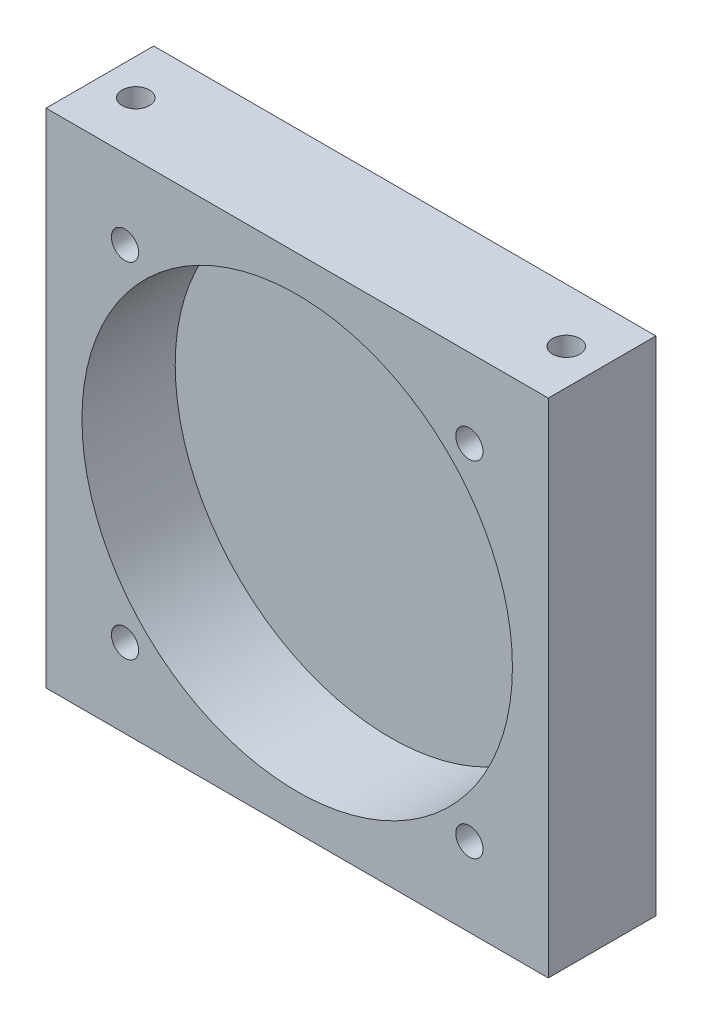
ISO-10303-21;
HEADER;
FILE_DESCRIPTION(('STEP AP214'),'2;1');
FILE_NAME('part.step','',(''),(''),'','','');
FILE_SCHEMA(('AUTOMOTIVE_DESIGN { 1 0 10303 214 1 1 1 1 }'));
ENDSEC;
DATA;
#1=APPLICATION_CONTEXT('core data for automotive mechanical design processes');
#2=APPLICATION_PROTOCOL_DEFINITION('international standard','automotive_design',2000,#1);
#3=PRODUCT_CONTEXT('',#1,'mechanical');
#4=PRODUCT('Part','Part','',(#3));
#5=PRODUCT_RELATED_PRODUCT_CATEGORY('part','',(#4));
#6=PRODUCT_DEFINITION_FORMATION('','',#4);
#7=PRODUCT_DEFINITION_CONTEXT('part definition',#1,'design');
#8=PRODUCT_DEFINITION('design','',#6,#7);
#9=PRODUCT_DEFINITION_SHAPE('','',#8);
#10=(LENGTH_UNIT() NAMED_UNIT(*) SI_UNIT(.MILLI.,.METRE.));
#11=(NAMED_UNIT(*) PLANE_ANGLE_UNIT() SI_UNIT($,.RADIAN.));
#12=(NAMED_UNIT(*) SI_UNIT($,.STERADIAN.) SOLID_ANGLE_UNIT());
#13=UNCERTAINTY_MEASURE_WITH_UNIT(LENGTH_MEASURE(1.E-05),#10,'distance_accuracy_value','');
#14=(GEOMETRIC_REPRESENTATION_CONTEXT(3) GLOBAL_UNCERTAINTY_ASSIGNED_CONTEXT((#13)) GLOBAL_UNIT_ASSIGNED_CONTEXT((#10,
#11,#12)) REPRESENTATION_CONTEXT('',''));
#15=CARTESIAN_POINT('',(0.,0.,0.));
#16=DIRECTION('',(0.,0.,1.));
#17=DIRECTION('',(1.,0.,0.));
#18=AXIS2_PLACEMENT_3D('',#15,#16,#17);
#19=CARTESIAN_POINT('',(-44.45,-44.45,19.05));
#20=DIRECTION('',(1.,0.,0.));
#21=DIRECTION('',(0.,0.,-1.));
#22=AXIS2_PLACEMENT_3D('',#19,#20,#21);
#23=PLANE('',#22);
#24=DIRECTION('',(0.,-1.,0.));
#25=VECTOR('',#24,1.);
#26=CARTESIAN_POINT('',(-44.45,-44.45,0.));
#27=LINE('',#26,#25);
#28=CARTESIAN_POINT('',(-44.45,44.45,0.));
#29=VERTEX_POINT('',#28);
#30=CARTESIAN_POINT('',(-44.45,-44.45,0.));
#31=VERTEX_POINT('',#30);
#32=EDGE_CURVE('E209',#29,#31,#27,.T.);
#33=ORIENTED_EDGE('',*,*,#32,.T.);
#34=DIRECTION('',(0.,0.,-1.));
#35=VECTOR('',#34,1.);
#36=CARTESIAN_POINT('',(-44.45,-44.45,19.05));
#37=LINE('',#36,#35);
#38=CARTESIAN_POINT('',(-44.45,-44.45,19.05));
#39=VERTEX_POINT('',#38);
#40=EDGE_CURVE('E11',#39,#31,#37,.T.);
#41=ORIENTED_EDGE('',*,*,#40,.F.);
#42=DIRECTION('',(0.,-1.,0.));
#43=VECTOR('',#42,1.);
#44=CARTESIAN_POINT('',(-44.45,-44.45,19.05));
#45=LINE('',#44,#43);
#46=CARTESIAN_POINT('',(-44.45,44.45,19.05));
#47=VERTEX_POINT('',#46);
#48=EDGE_CURVE('E212',#47,#39,#45,.T.);
#49=ORIENTED_EDGE('',*,*,#48,.F.);
#50=DIRECTION('',(0.,0.,-1.));
#51=VECTOR('',#50,1.);
#52=CARTESIAN_POINT('',(-44.45,44.45,19.05));
#53=LINE('',#52,#51);
#54=EDGE_CURVE('E218',#47,#29,#53,.T.);
#55=ORIENTED_EDGE('',*,*,#54,.T.);
#56=EDGE_LOOP('',(#33,#41,#49,#55));
#57=FACE_BOUND('',#56,.T.);
#58=ADVANCED_FACE('F32',(#57),#23,.F.);
#59=CARTESIAN_POINT('',(44.45,-44.45,19.05));
#60=DIRECTION('',(0.,1.,0.));
#61=DIRECTION('',(-1.,0.,0.));
#62=AXIS2_PLACEMENT_3D('',#59,#60,#61);
#63=PLANE('',#62);
#64=CARTESIAN_POINT('',(-38.1,-44.45,9.525));
#65=DIRECTION('',(0.,-1.,0.));
#66=DIRECTION('',(0.,0.,-1.));
#67=AXIS2_PLACEMENT_3D('',#64,#65,#66);
#68=CIRCLE('',#67,2.413);
#69=CARTESIAN_POINT('',(-38.1,-44.45,7.112));
#70=VERTEX_POINT('',#69);
#71=EDGE_CURVE('E157',#70,#70,#68,.T.);
#72=ORIENTED_EDGE('',*,*,#71,.F.);
#73=EDGE_LOOP('',(#72));
#74=FACE_BOUND('',#73,.T.);
#75=CARTESIAN_POINT('',(38.1,-44.45,9.525));
#76=DIRECTION('',(0.,-1.,0.));
#77=DIRECTION('',(0.,0.,-1.));
#78=AXIS2_PLACEMENT_3D('',#75,#76,#77);
#79=CIRCLE('',#78,2.413);
#80=CARTESIAN_POINT('',(38.1,-44.45,7.112));
#81=VERTEX_POINT('',#80);
#82=EDGE_CURVE('E169',#81,#81,#79,.T.);
#83=ORIENTED_EDGE('',*,*,#82,.F.);
#84=EDGE_LOOP('',(#83));
#85=FACE_BOUND('',#84,.T.);
#86=DIRECTION('',(1.,0.,0.));
#87=VECTOR('',#86,1.);
#88=CARTESIAN_POINT('',(44.45,-44.45,0.));
#89=LINE('',#88,#87);
#90=CARTESIAN_POINT('',(44.45,-44.45,0.));
#91=VERTEX_POINT('',#90);
#92=EDGE_CURVE('E221',#31,#91,#89,.T.);
#93=ORIENTED_EDGE('',*,*,#92,.T.);
#94=DIRECTION('',(0.,0.,-1.));
#95=VECTOR('',#94,1.);
#96=CARTESIAN_POINT('',(44.45,-44.45,19.05));
#97=LINE('',#96,#95);
#98=CARTESIAN_POINT('',(44.45,-44.45,19.05));
#99=VERTEX_POINT('',#98);
#100=EDGE_CURVE('E40',#99,#91,#97,.T.);
#101=ORIENTED_EDGE('',*,*,#100,.F.);
#102=DIRECTION('',(1.,0.,0.));
#103=VECTOR('',#102,1.);
#104=CARTESIAN_POINT('',(44.45,-44.45,19.05));
#105=LINE('',#104,#103);
#106=EDGE_CURVE('E79',#39,#99,#105,.T.);
#107=ORIENTED_EDGE('',*,*,#106,.F.);
#108=ORIENTED_EDGE('',*,*,#40,.T.);
#109=EDGE_LOOP('',(#93,#101,#107,#108));
#110=FACE_BOUND('',#109,.T.);
#111=ADVANCED_FACE('F246',(#74,#85,#110),#63,.F.);
#112=CARTESIAN_POINT('',(44.45,-44.45,19.05));
#113=DIRECTION('',(-1.,0.,0.));
#114=DIRECTION('',(0.,0.,1.));
#115=AXIS2_PLACEMENT_3D('',#112,#113,#114);
#116=PLANE('',#115);
#117=DIRECTION('',(0.,1.,0.));
#118=VECTOR('',#117,1.);
#119=CARTESIAN_POINT('',(44.45,-44.45,0.));
#120=LINE('',#119,#118);
#121=CARTESIAN_POINT('',(44.45,44.45,0.));
#122=VERTEX_POINT('',#121);
#123=EDGE_CURVE('E66',#91,#122,#120,.T.);
#124=ORIENTED_EDGE('',*,*,#123,.T.);
#125=DIRECTION('',(0.,0.,-1.));
#126=VECTOR('',#125,1.);
#127=CARTESIAN_POINT('',(44.45,44.45,19.05));
#128=LINE('',#127,#126);
#129=CARTESIAN_POINT('',(44.45,44.45,19.05));
#130=VERTEX_POINT('',#129);
#131=EDGE_CURVE('E226',#130,#122,#128,.T.);
#132=ORIENTED_EDGE('',*,*,#131,.F.);
#133=DIRECTION('',(0.,1.,0.));
#134=VECTOR('',#133,1.);
#135=CARTESIAN_POINT('',(44.45,-44.45,19.05));
#136=LINE('',#135,#134);
#137=EDGE_CURVE('E215',#99,#130,#136,.T.);
#138=ORIENTED_EDGE('',*,*,#137,.F.);
#139=ORIENTED_EDGE('',*,*,#100,.T.);
#140=EDGE_LOOP('',(#124,#132,#138,#139));
#141=FACE_BOUND('',#140,.T.);
#142=ADVANCED_FACE('F228',(#141),#116,.F.);
#143=CARTESIAN_POINT('',(44.45,44.45,19.05));
#144=DIRECTION('',(0.,-1.,0.));
#145=DIRECTION('',(1.,0.,0.));
#146=AXIS2_PLACEMENT_3D('',#143,#144,#145);
#147=PLANE('',#146);
#148=CARTESIAN_POINT('',(-38.1,44.45,9.525));
#149=DIRECTION('',(0.,1.,0.));
#150=DIRECTION('',(0.,0.,1.));
#151=AXIS2_PLACEMENT_3D('',#148,#149,#150);
#152=CIRCLE('',#151,2.413);
#153=CARTESIAN_POINT('',(-38.1,44.45,11.938));
#154=VERTEX_POINT('',#153);
#155=EDGE_CURVE('E181',#154,#154,#152,.T.);
#156=ORIENTED_EDGE('',*,*,#155,.F.);
#157=EDGE_LOOP('',(#156));
#158=FACE_BOUND('',#157,.T.);
#159=CARTESIAN_POINT('',(38.1,44.45,9.525));
#160=DIRECTION('',(0.,1.,0.));
#161=DIRECTION('',(0.,0.,1.));
#162=AXIS2_PLACEMENT_3D('',#159,#160,#161);
#163=CIRCLE('',#162,2.413);
#164=CARTESIAN_POINT('',(38.1,44.45,11.938));
#165=VERTEX_POINT('',#164);
#166=EDGE_CURVE('E193',#165,#165,#163,.T.);
#167=ORIENTED_EDGE('',*,*,#166,.F.);
#168=EDGE_LOOP('',(#167));
#169=FACE_BOUND('',#168,.T.);
#170=DIRECTION('',(-1.,0.,0.));
#171=VECTOR('',#170,1.);
#172=CARTESIAN_POINT('',(44.45,44.45,0.));
#173=LINE('',#172,#171);
#174=EDGE_CURVE('E72',#122,#29,#173,.T.);
#175=ORIENTED_EDGE('',*,*,#174,.T.);
#176=ORIENTED_EDGE('',*,*,#54,.F.);
#177=DIRECTION('',(-1.,0.,0.));
#178=VECTOR('',#177,1.);
#179=CARTESIAN_POINT('',(44.45,44.45,19.05));
#180=LINE('',#179,#178);
#181=EDGE_CURVE('E48',#130,#47,#180,.T.);
#182=ORIENTED_EDGE('',*,*,#181,.F.);
#183=ORIENTED_EDGE('',*,*,#131,.T.);
#184=EDGE_LOOP('',(#175,#176,#182,#183));
#185=FACE_BOUND('',#184,.T.);
#186=ADVANCED_FACE('F235',(#158,#169,#185),#147,.F.);
#187=CARTESIAN_POINT('',(-44.45,44.45,19.05));
#188=DIRECTION('',(0.,0.,1.));
#189=DIRECTION('',(1.,0.,0.));
#190=AXIS2_PLACEMENT_3D('',#187,#188,#189);
#191=PLANE('',#190);
#192=CARTESIAN_POINT('',(30.48,-30.48,19.0500000000001));
#193=DIRECTION('',(0.,0.,1.));
#194=DIRECTION('',(1.,0.,0.));
#195=AXIS2_PLACEMENT_3D('',#192,#193,#194);
#196=CIRCLE('',#195,2.413);
#197=CARTESIAN_POINT('',(32.893,-30.48,19.0500000000001));
#198=VERTEX_POINT('',#197);
#199=EDGE_CURVE('E590',#198,#198,#196,.T.);
#200=ORIENTED_EDGE('',*,*,#199,.F.);
#201=EDGE_LOOP('',(#200));
#202=FACE_BOUND('',#201,.T.);
#203=CARTESIAN_POINT('',(-30.48,-30.48,19.0500000000001));
#204=DIRECTION('',(0.,0.,1.));
#205=DIRECTION('',(1.,0.,0.));
#206=AXIS2_PLACEMENT_3D('',#203,#204,#205);
#207=CIRCLE('',#206,2.413);
#208=CARTESIAN_POINT('',(-28.067,-30.48,19.0500000000001));
#209=VERTEX_POINT('',#208);
#210=EDGE_CURVE('E114',#209,#209,#207,.T.);
#211=ORIENTED_EDGE('',*,*,#210,.F.);
#212=EDGE_LOOP('',(#211));
#213=FACE_BOUND('',#212,.T.);
#214=CARTESIAN_POINT('',(-30.48,30.48,19.0500000000001));
#215=DIRECTION('',(0.,0.,1.));
#216=DIRECTION('',(1.,0.,0.));
#217=AXIS2_PLACEMENT_3D('',#214,#215,#216);
#218=CIRCLE('',#217,2.413);
#219=CARTESIAN_POINT('',(-28.067,30.48,19.0500000000001));
#220=VERTEX_POINT('',#219);
#221=EDGE_CURVE('E133',#220,#220,#218,.T.);
#222=ORIENTED_EDGE('',*,*,#221,.F.);
#223=EDGE_LOOP('',(#222));
#224=FACE_BOUND('',#223,.T.);
#225=CARTESIAN_POINT('',(30.48,30.48,19.0500000000001));
#226=DIRECTION('',(0.,0.,1.));
#227=DIRECTION('',(1.,0.,0.));
#228=AXIS2_PLACEMENT_3D('',#225,#226,#227);
#229=CIRCLE('',#228,2.413);
#230=CARTESIAN_POINT('',(32.893,30.48,19.0500000000001));
#231=VERTEX_POINT('',#230);
#232=EDGE_CURVE('E145',#231,#231,#229,.T.);
#233=ORIENTED_EDGE('',*,*,#232,.F.);
#234=EDGE_LOOP('',(#233));
#235=FACE_BOUND('',#234,.T.);
#236=CARTESIAN_POINT('',(0.,0.,19.05));
#237=DIRECTION('',(0.,0.,1.));
#238=DIRECTION('',(1.,0.,0.));
#239=AXIS2_PLACEMENT_3D('',#236,#237,#238);
#240=CIRCLE('',#239,38.1);
#241=CARTESIAN_POINT('',(38.1,0.,19.05));
#242=VERTEX_POINT('',#241);
#243=EDGE_CURVE('E205',#242,#242,#240,.T.);
#244=ORIENTED_EDGE('',*,*,#243,.F.);
#245=EDGE_LOOP('',(#244));
#246=FACE_BOUND('',#245,.T.);
#247=ORIENTED_EDGE('',*,*,#48,.T.);
#248=ORIENTED_EDGE('',*,*,#106,.T.);
#249=ORIENTED_EDGE('',*,*,#137,.T.);
#250=ORIENTED_EDGE('',*,*,#181,.T.);
#251=EDGE_LOOP('',(#247,#248,#249,#250));
#252=FACE_BOUND('',#251,.T.);
#253=ADVANCED_FACE('F237',(#202,#213,#224,#235,#246,#252),#191,.T.);
#254=CARTESIAN_POINT('',(-44.45,44.45,0.));
#255=DIRECTION('',(0.,0.,1.));
#256=DIRECTION('',(1.,0.,0.));
#257=AXIS2_PLACEMENT_3D('',#254,#255,#256);
#258=PLANE('',#257);
#259=ORIENTED_EDGE('',*,*,#32,.F.);
#260=ORIENTED_EDGE('',*,*,#174,.F.);
#261=ORIENTED_EDGE('',*,*,#123,.F.);
#262=ORIENTED_EDGE('',*,*,#92,.F.);
#263=EDGE_LOOP('',(#259,#260,#261,#262));
#264=FACE_BOUND('',#263,.T.);
#265=ADVANCED_FACE('F231',(#264),#258,.F.);
#266=CARTESIAN_POINT('',(0.,0.,2.54));
#267=DIRECTION('',(0.,0.,1.));
#268=DIRECTION('',(1.,0.,0.));
#269=AXIS2_PLACEMENT_3D('',#266,#267,#268);
#270=CYLINDRICAL_SURFACE('',#269,38.1);
#271=CARTESIAN_POINT('',(0.,0.,2.54));
#272=DIRECTION('',(0.,0.,1.));
#273=DIRECTION('',(1.,0.,0.));
#274=AXIS2_PLACEMENT_3D('',#271,#272,#273);
#275=CIRCLE('',#274,38.1);
#276=CARTESIAN_POINT('',(38.1,0.,2.54));
#277=VERTEX_POINT('',#276);
#278=EDGE_CURVE('E206',#277,#277,#275,.T.);
#279=ORIENTED_EDGE('',*,*,#278,.F.);
#280=EDGE_LOOP('',(#279));
#281=FACE_BOUND('',#280,.T.);
#282=ORIENTED_EDGE('',*,*,#243,.T.);
#283=EDGE_LOOP('',(#282));
#284=FACE_BOUND('',#283,.T.);
#285=ADVANCED_FACE('F323',(#281,#284),#270,.F.);
#286=CARTESIAN_POINT('',(0.,0.,2.54));
#287=DIRECTION('',(0.,0.,1.));
#288=DIRECTION('',(1.,0.,0.));
#289=AXIS2_PLACEMENT_3D('',#286,#287,#288);
#290=PLANE('',#289);
#291=ORIENTED_EDGE('',*,*,#278,.T.);
#292=EDGE_LOOP('',(#291));
#293=FACE_BOUND('',#292,.T.);
#294=ADVANCED_FACE('F319',(#293),#290,.T.);
#295=CARTESIAN_POINT('',(38.1,23.02256,9.525));
#296=DIRECTION('',(0.,1.,0.));
#297=DIRECTION('',(0.,0.,1.));
#298=AXIS2_PLACEMENT_3D('',#295,#296,#297);
#299=CONICAL_SURFACE('',#298,2.01929999999999,1.02974425867665);
#300=CARTESIAN_POINT('',(38.1,21.8092421519977,9.525));
#301=VERTEX_POINT('',#300);
#302=VERTEX_LOOP('',#301);
#303=FACE_BOUND('',#302,.T.);
#304=CARTESIAN_POINT('',(38.1,23.02256,9.525));
#305=DIRECTION('',(0.,1.,0.));
#306=DIRECTION('',(0.,0.,1.));
#307=AXIS2_PLACEMENT_3D('',#304,#305,#306);
#308=CIRCLE('',#307,2.01929999999999);
#309=CARTESIAN_POINT('',(38.1,23.02256,11.5443));
#310=VERTEX_POINT('',#309);
#311=EDGE_CURVE('E202',#310,#310,#308,.T.);
#312=ORIENTED_EDGE('',*,*,#311,.T.);
#313=EDGE_LOOP('',(#312));
#314=FACE_BOUND('',#313,.T.);
#315=ADVANCED_FACE('F315',(#303,#314),#299,.F.);
#316=CARTESIAN_POINT('',(38.1,44.45,9.525));
#317=DIRECTION('',(0.,1.,0.));
#318=DIRECTION('',(0.,0.,1.));
#319=AXIS2_PLACEMENT_3D('',#316,#317,#318);
#320=CYLINDRICAL_SURFACE('',#319,2.01929999999999);
#321=ORIENTED_EDGE('',*,*,#311,.F.);
#322=EDGE_LOOP('',(#321));
#323=FACE_BOUND('',#322,.T.);
#324=CARTESIAN_POINT('',(38.1,25.4,9.525));
#325=DIRECTION('',(0.,1.,0.));
#326=DIRECTION('',(0.,0.,1.));
#327=AXIS2_PLACEMENT_3D('',#324,#325,#326);
#328=CIRCLE('',#327,2.01929999999999);
#329=CARTESIAN_POINT('',(38.1,25.4,11.5443));
#330=VERTEX_POINT('',#329);
#331=EDGE_CURVE('E199',#330,#330,#328,.T.);
#332=ORIENTED_EDGE('',*,*,#331,.T.);
#333=EDGE_LOOP('',(#332));
#334=FACE_BOUND('',#333,.T.);
#335=ADVANCED_FACE('F311',(#323,#334),#320,.F.);
#336=CARTESIAN_POINT('',(40.1193,25.4,9.525));
#337=DIRECTION('',(0.,-1.,0.));
#338=DIRECTION('',(0.,0.,-1.));
#339=AXIS2_PLACEMENT_3D('',#336,#337,#338);
#340=PLANE('',#339);
#341=ORIENTED_EDGE('',*,*,#331,.F.);
#342=EDGE_LOOP('',(#341));
#343=FACE_BOUND('',#342,.T.);
#344=CARTESIAN_POINT('',(38.1,25.4,9.525));
#345=DIRECTION('',(0.,1.,0.));
#346=DIRECTION('',(0.,0.,1.));
#347=AXIS2_PLACEMENT_3D('',#344,#345,#346);
#348=CIRCLE('',#347,2.413);
#349=CARTESIAN_POINT('',(38.1,25.4,11.938));
#350=VERTEX_POINT('',#349);
#351=EDGE_CURVE('E196',#350,#350,#348,.T.);
#352=ORIENTED_EDGE('',*,*,#351,.T.);
#353=EDGE_LOOP('',(#352));
#354=FACE_BOUND('',#353,.T.);
#355=ADVANCED_FACE('F307',(#343,#354),#340,.F.);
#356=CARTESIAN_POINT('',(38.1,44.45,9.525));
#357=DIRECTION('',(0.,1.,0.));
#358=DIRECTION('',(0.,0.,1.));
#359=AXIS2_PLACEMENT_3D('',#356,#357,#358);
#360=CYLINDRICAL_SURFACE('',#359,2.413);
#361=ORIENTED_EDGE('',*,*,#351,.F.);
#362=EDGE_LOOP('',(#361));
#363=FACE_BOUND('',#362,.T.);
#364=ORIENTED_EDGE('',*,*,#166,.T.);
#365=EDGE_LOOP('',(#364));
#366=FACE_BOUND('',#365,.T.);
#367=ADVANCED_FACE('F303',(#363,#366),#360,.F.);
#368=CARTESIAN_POINT('',(-38.1,23.02256,9.525));
#369=DIRECTION('',(0.,1.,0.));
#370=DIRECTION('',(0.,0.,1.));
#371=AXIS2_PLACEMENT_3D('',#368,#369,#370);
#372=CONICAL_SURFACE('',#371,2.01929999999999,1.02974425867665);
#373=CARTESIAN_POINT('',(-38.1,21.8092421519977,9.525));
#374=VERTEX_POINT('',#373);
#375=VERTEX_LOOP('',#374);
#376=FACE_BOUND('',#375,.T.);
#377=CARTESIAN_POINT('',(-38.1,23.02256,9.525));
#378=DIRECTION('',(0.,1.,0.));
#379=DIRECTION('',(0.,0.,1.));
#380=AXIS2_PLACEMENT_3D('',#377,#378,#379);
#381=CIRCLE('',#380,2.01929999999999);
#382=CARTESIAN_POINT('',(-38.1,23.02256,11.5443));
#383=VERTEX_POINT('',#382);
#384=EDGE_CURVE('E190',#383,#383,#381,.T.);
#385=ORIENTED_EDGE('',*,*,#384,.T.);
#386=EDGE_LOOP('',(#385));
#387=FACE_BOUND('',#386,.T.);
#388=ADVANCED_FACE('F299',(#376,#387),#372,.F.);
#389=CARTESIAN_POINT('',(-38.1,44.45,9.525));
#390=DIRECTION('',(0.,1.,0.));
#391=DIRECTION('',(0.,0.,1.));
#392=AXIS2_PLACEMENT_3D('',#389,#390,#391);
#393=CYLINDRICAL_SURFACE('',#392,2.01929999999999);
#394=ORIENTED_EDGE('',*,*,#384,.F.);
#395=EDGE_LOOP('',(#394));
#396=FACE_BOUND('',#395,.T.);
#397=CARTESIAN_POINT('',(-38.1,25.4,9.525));
#398=DIRECTION('',(0.,1.,0.));
#399=DIRECTION('',(0.,0.,1.));
#400=AXIS2_PLACEMENT_3D('',#397,#398,#399);
#401=CIRCLE('',#400,2.01929999999999);
#402=CARTESIAN_POINT('',(-38.1,25.4,11.5443));
#403=VERTEX_POINT('',#402);
#404=EDGE_CURVE('E187',#403,#403,#401,.T.);
#405=ORIENTED_EDGE('',*,*,#404,.T.);
#406=EDGE_LOOP('',(#405));
#407=FACE_BOUND('',#406,.T.);
#408=ADVANCED_FACE('F295',(#396,#407),#393,.F.);
#409=CARTESIAN_POINT('',(-36.0807,25.4,9.525));
#410=DIRECTION('',(0.,-1.,0.));
#411=DIRECTION('',(0.,0.,-1.));
#412=AXIS2_PLACEMENT_3D('',#409,#410,#411);
#413=PLANE('',#412);
#414=ORIENTED_EDGE('',*,*,#404,.F.);
#415=EDGE_LOOP('',(#414));
#416=FACE_BOUND('',#415,.T.);
#417=CARTESIAN_POINT('',(-38.1,25.4,9.525));
#418=DIRECTION('',(0.,1.,0.));
#419=DIRECTION('',(0.,0.,1.));
#420=AXIS2_PLACEMENT_3D('',#417,#418,#419);
#421=CIRCLE('',#420,2.413);
#422=CARTESIAN_POINT('',(-38.1,25.4,11.938));
#423=VERTEX_POINT('',#422);
#424=EDGE_CURVE('E184',#423,#423,#421,.T.);
#425=ORIENTED_EDGE('',*,*,#424,.T.);
#426=EDGE_LOOP('',(#425));
#427=FACE_BOUND('',#426,.T.);
#428=ADVANCED_FACE('F291',(#416,#427),#413,.F.);
#429=CARTESIAN_POINT('',(-38.1,44.45,9.525));
#430=DIRECTION('',(0.,1.,0.));
#431=DIRECTION('',(0.,0.,1.));
#432=AXIS2_PLACEMENT_3D('',#429,#430,#431);
#433=CYLINDRICAL_SURFACE('',#432,2.413);
#434=ORIENTED_EDGE('',*,*,#424,.F.);
#435=EDGE_LOOP('',(#434));
#436=FACE_BOUND('',#435,.T.);
#437=ORIENTED_EDGE('',*,*,#155,.T.);
#438=EDGE_LOOP('',(#437));
#439=FACE_BOUND('',#438,.T.);
#440=ADVANCED_FACE('F287',(#436,#439),#433,.F.);
#441=CARTESIAN_POINT('',(38.1,-23.02256,9.525));
#442=DIRECTION('',(0.,-1.,0.));
#443=DIRECTION('',(0.,0.,-1.));
#444=AXIS2_PLACEMENT_3D('',#441,#442,#443);
#445=CONICAL_SURFACE('',#444,2.01929999999999,1.02974425867665);
#446=CARTESIAN_POINT('',(38.1,-21.8092421519977,9.525));
#447=VERTEX_POINT('',#446);
#448=VERTEX_LOOP('',#447);
#449=FACE_BOUND('',#448,.T.);
#450=CARTESIAN_POINT('',(38.1,-23.02256,9.525));
#451=DIRECTION('',(0.,-1.,0.));
#452=DIRECTION('',(0.,0.,-1.));
#453=AXIS2_PLACEMENT_3D('',#450,#451,#452);
#454=CIRCLE('',#453,2.01929999999999);
#455=CARTESIAN_POINT('',(38.1,-23.02256,7.50570000000001));
#456=VERTEX_POINT('',#455);
#457=EDGE_CURVE('E178',#456,#456,#454,.T.);
#458=ORIENTED_EDGE('',*,*,#457,.T.);
#459=EDGE_LOOP('',(#458));
#460=FACE_BOUND('',#459,.T.);
#461=ADVANCED_FACE('F283',(#449,#460),#445,.F.);
#462=CARTESIAN_POINT('',(38.1,-44.45,9.525));
#463=DIRECTION('',(0.,-1.,0.));
#464=DIRECTION('',(0.,0.,-1.));
#465=AXIS2_PLACEMENT_3D('',#462,#463,#464);
#466=CYLINDRICAL_SURFACE('',#465,2.01929999999999);
#467=ORIENTED_EDGE('',*,*,#457,.F.);
#468=EDGE_LOOP('',(#467));
#469=FACE_BOUND('',#468,.T.);
#470=CARTESIAN_POINT('',(38.1,-25.4,9.525));
#471=DIRECTION('',(0.,-1.,0.));
#472=DIRECTION('',(0.,0.,-1.));
#473=AXIS2_PLACEMENT_3D('',#470,#471,#472);
#474=CIRCLE('',#473,2.01929999999999);
#475=CARTESIAN_POINT('',(38.1,-25.4,7.50570000000001));
#476=VERTEX_POINT('',#475);
#477=EDGE_CURVE('E175',#476,#476,#474,.T.);
#478=ORIENTED_EDGE('',*,*,#477,.T.);
#479=EDGE_LOOP('',(#478));
#480=FACE_BOUND('',#479,.T.);
#481=ADVANCED_FACE('F275',(#469,#480),#466,.F.);
#482=CARTESIAN_POINT('',(40.1193,-25.4,9.525));
#483=DIRECTION('',(0.,1.,0.));
#484=DIRECTION('',(0.,0.,1.));
#485=AXIS2_PLACEMENT_3D('',#482,#483,#484);
#486=PLANE('',#485);
#487=ORIENTED_EDGE('',*,*,#477,.F.);
#488=EDGE_LOOP('',(#487));
#489=FACE_BOUND('',#488,.T.);
#490=CARTESIAN_POINT('',(38.1,-25.4,9.525));
#491=DIRECTION('',(0.,-1.,0.));
#492=DIRECTION('',(0.,0.,-1.));
#493=AXIS2_PLACEMENT_3D('',#490,#491,#492);
#494=CIRCLE('',#493,2.413);
#495=CARTESIAN_POINT('',(38.1,-25.4,7.112));
#496=VERTEX_POINT('',#495);
#497=EDGE_CURVE('E172',#496,#496,#494,.T.);
#498=ORIENTED_EDGE('',*,*,#497,.T.);
#499=EDGE_LOOP('',(#498));
#500=FACE_BOUND('',#499,.T.);
#501=ADVANCED_FACE('F265',(#489,#500),#486,.F.);
#502=CARTESIAN_POINT('',(38.1,-44.45,9.525));
#503=DIRECTION('',(0.,-1.,0.));
#504=DIRECTION('',(0.,0.,-1.));
#505=AXIS2_PLACEMENT_3D('',#502,#503,#504);
#506=CYLINDRICAL_SURFACE('',#505,2.413);
#507=ORIENTED_EDGE('',*,*,#497,.F.);
#508=EDGE_LOOP('',(#507));
#509=FACE_BOUND('',#508,.T.);
#510=ORIENTED_EDGE('',*,*,#82,.T.);
#511=EDGE_LOOP('',(#510));
#512=FACE_BOUND('',#511,.T.);
#513=ADVANCED_FACE('F262',(#509,#512),#506,.F.);
#514=CARTESIAN_POINT('',(-38.1,-23.02256,9.525));
#515=DIRECTION('',(0.,-1.,0.));
#516=DIRECTION('',(0.,0.,-1.));
#517=AXIS2_PLACEMENT_3D('',#514,#515,#516);
#518=CONICAL_SURFACE('',#517,2.01929999999999,1.02974425867665);
#519=CARTESIAN_POINT('',(-38.1,-21.8092421519977,9.525));
#520=VERTEX_POINT('',#519);
#521=VERTEX_LOOP('',#520);
#522=FACE_BOUND('',#521,.T.);
#523=CARTESIAN_POINT('',(-38.1,-23.02256,9.525));
#524=DIRECTION('',(0.,-1.,0.));
#525=DIRECTION('',(0.,0.,-1.));
#526=AXIS2_PLACEMENT_3D('',#523,#524,#525);
#527=CIRCLE('',#526,2.01929999999999);
#528=CARTESIAN_POINT('',(-38.1,-23.02256,7.50570000000001));
#529=VERTEX_POINT('',#528);
#530=EDGE_CURVE('E166',#529,#529,#527,.T.);
#531=ORIENTED_EDGE('',*,*,#530,.T.);
#532=EDGE_LOOP('',(#531));
#533=FACE_BOUND('',#532,.T.);
#534=ADVANCED_FACE('F264',(#522,#533),#518,.F.);
#535=CARTESIAN_POINT('',(-38.1,-44.45,9.525));
#536=DIRECTION('',(0.,-1.,0.));
#537=DIRECTION('',(0.,0.,-1.));
#538=AXIS2_PLACEMENT_3D('',#535,#536,#537);
#539=CYLINDRICAL_SURFACE('',#538,2.01929999999999);
#540=ORIENTED_EDGE('',*,*,#530,.F.);
#541=EDGE_LOOP('',(#540));
#542=FACE_BOUND('',#541,.T.);
#543=CARTESIAN_POINT('',(-38.1,-25.4,9.525));
#544=DIRECTION('',(0.,-1.,0.));
#545=DIRECTION('',(0.,0.,-1.));
#546=AXIS2_PLACEMENT_3D('',#543,#544,#545);
#547=CIRCLE('',#546,2.01929999999999);
#548=CARTESIAN_POINT('',(-38.1,-25.4,7.50570000000001));
#549=VERTEX_POINT('',#548);
#550=EDGE_CURVE('E163',#549,#549,#547,.T.);
#551=ORIENTED_EDGE('',*,*,#550,.T.);
#552=EDGE_LOOP('',(#551));
#553=FACE_BOUND('',#552,.T.);
#554=ADVANCED_FACE('F272',(#542,#553),#539,.F.);
#555=CARTESIAN_POINT('',(-36.0807,-25.4,9.525));
#556=DIRECTION('',(0.,1.,0.));
#557=DIRECTION('',(0.,0.,1.));
#558=AXIS2_PLACEMENT_3D('',#555,#556,#557);
#559=PLANE('',#558);
#560=ORIENTED_EDGE('',*,*,#550,.F.);
#561=EDGE_LOOP('',(#560));
#562=FACE_BOUND('',#561,.T.);
#563=CARTESIAN_POINT('',(-38.1,-25.4,9.525));
#564=DIRECTION('',(0.,-1.,0.));
#565=DIRECTION('',(0.,0.,-1.));
#566=AXIS2_PLACEMENT_3D('',#563,#564,#565);
#567=CIRCLE('',#566,2.413);
#568=CARTESIAN_POINT('',(-38.1,-25.4,7.112));
#569=VERTEX_POINT('',#568);
#570=EDGE_CURVE('E160',#569,#569,#567,.T.);
#571=ORIENTED_EDGE('',*,*,#570,.T.);
#572=EDGE_LOOP('',(#571));
#573=FACE_BOUND('',#572,.T.);
#574=ADVANCED_FACE('F404',(#562,#573),#559,.F.);
#575=CARTESIAN_POINT('',(-38.1,-44.45,9.525));
#576=DIRECTION('',(0.,-1.,0.));
#577=DIRECTION('',(0.,0.,-1.));
#578=AXIS2_PLACEMENT_3D('',#575,#576,#577);
#579=CYLINDRICAL_SURFACE('',#578,2.413);
#580=ORIENTED_EDGE('',*,*,#570,.F.);
#581=EDGE_LOOP('',(#580));
#582=FACE_BOUND('',#581,.T.);
#583=ORIENTED_EDGE('',*,*,#71,.T.);
#584=EDGE_LOOP('',(#583));
#585=FACE_BOUND('',#584,.T.);
#586=ADVANCED_FACE('F413',(#582,#585),#579,.F.);
#587=CARTESIAN_POINT('',(30.48,30.48,4.064));
#588=DIRECTION('',(0.,0.,1.));
#589=DIRECTION('',(1.,0.,0.));
#590=AXIS2_PLACEMENT_3D('',#587,#588,#589);
#591=CONICAL_SURFACE('',#590,2.01929999999999,1.02974425867665);
#592=CARTESIAN_POINT('',(30.48,30.48,2.85068215199765));
#593=VERTEX_POINT('',#592);
#594=VERTEX_LOOP('',#593);
#595=FACE_BOUND('',#594,.T.);
#596=CARTESIAN_POINT('',(30.48,30.48,4.064));
#597=DIRECTION('',(0.,0.,1.));
#598=DIRECTION('',(1.,0.,0.));
#599=AXIS2_PLACEMENT_3D('',#596,#597,#598);
#600=CIRCLE('',#599,2.01929999999999);
#601=CARTESIAN_POINT('',(32.4993,30.48,4.064));
#602=VERTEX_POINT('',#601);
#603=EDGE_CURVE('E154',#602,#602,#600,.T.);
#604=ORIENTED_EDGE('',*,*,#603,.T.);
#605=EDGE_LOOP('',(#604));
#606=FACE_BOUND('',#605,.T.);
#607=ADVANCED_FACE('F422',(#595,#606),#591,.F.);
#608=CARTESIAN_POINT('',(30.48,30.48,19.05));
#609=DIRECTION('',(0.,0.,1.));
#610=DIRECTION('',(1.,0.,0.));
#611=AXIS2_PLACEMENT_3D('',#608,#609,#610);
#612=CYLINDRICAL_SURFACE('',#611,2.01929999999999);
#613=ORIENTED_EDGE('',*,*,#603,.F.);
#614=EDGE_LOOP('',(#613));
#615=FACE_BOUND('',#614,.T.);
#616=CARTESIAN_POINT('',(30.48,30.48,6.35));
#617=DIRECTION('',(0.,0.,1.));
#618=DIRECTION('',(1.,0.,0.));
#619=AXIS2_PLACEMENT_3D('',#616,#617,#618);
#620=CIRCLE('',#619,2.01929999999999);
#621=CARTESIAN_POINT('',(32.4993,30.48,6.35));
#622=VERTEX_POINT('',#621);
#623=EDGE_CURVE('E151',#622,#622,#620,.T.);
#624=ORIENTED_EDGE('',*,*,#623,.T.);
#625=EDGE_LOOP('',(#624));
#626=FACE_BOUND('',#625,.T.);
#627=ADVANCED_FACE('F438',(#615,#626),#612,.F.);
#628=CARTESIAN_POINT('',(32.4993,30.48,6.35));
#629=DIRECTION('',(0.,0.,-1.));
#630=DIRECTION('',(-1.,0.,0.));
#631=AXIS2_PLACEMENT_3D('',#628,#629,#630);
#632=PLANE('',#631);
#633=ORIENTED_EDGE('',*,*,#623,.F.);
#634=EDGE_LOOP('',(#633));
#635=FACE_BOUND('',#634,.T.);
#636=CARTESIAN_POINT('',(30.48,30.48,6.35));
#637=DIRECTION('',(0.,0.,1.));
#638=DIRECTION('',(1.,0.,0.));
#639=AXIS2_PLACEMENT_3D('',#636,#637,#638);
#640=CIRCLE('',#639,2.413);
#641=CARTESIAN_POINT('',(32.893,30.48,6.35));
#642=VERTEX_POINT('',#641);
#643=EDGE_CURVE('E148',#642,#642,#640,.T.);
#644=ORIENTED_EDGE('',*,*,#643,.T.);
#645=EDGE_LOOP('',(#644));
#646=FACE_BOUND('',#645,.T.);
#647=ADVANCED_FACE('F448',(#635,#646),#632,.F.);
#648=CARTESIAN_POINT('',(30.48,30.48,19.05));
#649=DIRECTION('',(0.,0.,1.));
#650=DIRECTION('',(1.,0.,0.));
#651=AXIS2_PLACEMENT_3D('',#648,#649,#650);
#652=CYLINDRICAL_SURFACE('',#651,2.413);
#653=ORIENTED_EDGE('',*,*,#643,.F.);
#654=EDGE_LOOP('',(#653));
#655=FACE_BOUND('',#654,.T.);
#656=ORIENTED_EDGE('',*,*,#232,.T.);
#657=EDGE_LOOP('',(#656));
#658=FACE_BOUND('',#657,.T.);
#659=ADVANCED_FACE('F458',(#655,#658),#652,.F.);
#660=CARTESIAN_POINT('',(-30.48,30.48,4.064));
#661=DIRECTION('',(0.,0.,1.));
#662=DIRECTION('',(1.,0.,0.));
#663=AXIS2_PLACEMENT_3D('',#660,#661,#662);
#664=CONICAL_SURFACE('',#663,2.01929999999999,1.02974425867665);
#665=CARTESIAN_POINT('',(-30.48,30.48,2.85068215199765));
#666=VERTEX_POINT('',#665);
#667=VERTEX_LOOP('',#666);
#668=FACE_BOUND('',#667,.T.);
#669=CARTESIAN_POINT('',(-30.48,30.48,4.064));
#670=DIRECTION('',(0.,0.,1.));
#671=DIRECTION('',(1.,0.,0.));
#672=AXIS2_PLACEMENT_3D('',#669,#670,#671);
#673=CIRCLE('',#672,2.01929999999999);
#674=CARTESIAN_POINT('',(-28.4607,30.48,4.064));
#675=VERTEX_POINT('',#674);
#676=EDGE_CURVE('E142',#675,#675,#673,.T.);
#677=ORIENTED_EDGE('',*,*,#676,.T.);
#678=EDGE_LOOP('',(#677));
#679=FACE_BOUND('',#678,.T.);
#680=ADVANCED_FACE('F468',(#668,#679),#664,.F.);
#681=CARTESIAN_POINT('',(-30.48,30.48,19.05));
#682=DIRECTION('',(0.,0.,1.));
#683=DIRECTION('',(1.,0.,0.));
#684=AXIS2_PLACEMENT_3D('',#681,#682,#683);
#685=CYLINDRICAL_SURFACE('',#684,2.01929999999999);
#686=ORIENTED_EDGE('',*,*,#676,.F.);
#687=EDGE_LOOP('',(#686));
#688=FACE_BOUND('',#687,.T.);
#689=CARTESIAN_POINT('',(-30.48,30.48,6.35));
#690=DIRECTION('',(0.,0.,1.));
#691=DIRECTION('',(1.,0.,0.));
#692=AXIS2_PLACEMENT_3D('',#689,#690,#691);
#693=CIRCLE('',#692,2.01929999999999);
#694=CARTESIAN_POINT('',(-28.4607,30.48,6.35));
#695=VERTEX_POINT('',#694);
#696=EDGE_CURVE('E139',#695,#695,#693,.T.);
#697=ORIENTED_EDGE('',*,*,#696,.T.);
#698=EDGE_LOOP('',(#697));
#699=FACE_BOUND('',#698,.T.);
#700=ADVANCED_FACE('F478',(#688,#699),#685,.F.);
#701=CARTESIAN_POINT('',(-28.4607,30.48,6.35));
#702=DIRECTION('',(0.,0.,-1.));
#703=DIRECTION('',(-1.,0.,0.));
#704=AXIS2_PLACEMENT_3D('',#701,#702,#703);
#705=PLANE('',#704);
#706=ORIENTED_EDGE('',*,*,#696,.F.);
#707=EDGE_LOOP('',(#706));
#708=FACE_BOUND('',#707,.T.);
#709=CARTESIAN_POINT('',(-30.48,30.48,6.35));
#710=DIRECTION('',(0.,0.,1.));
#711=DIRECTION('',(1.,0.,0.));
#712=AXIS2_PLACEMENT_3D('',#709,#710,#711);
#713=CIRCLE('',#712,2.41299999999999);
#714=CARTESIAN_POINT('',(-28.067,30.48,6.35));
#715=VERTEX_POINT('',#714);
#716=EDGE_CURVE('E136',#715,#715,#713,.T.);
#717=ORIENTED_EDGE('',*,*,#716,.T.);
#718=EDGE_LOOP('',(#717));
#719=FACE_BOUND('',#718,.T.);
#720=ADVANCED_FACE('F488',(#708,#719),#705,.F.);
#721=CARTESIAN_POINT('',(-30.48,30.48,19.05));
#722=DIRECTION('',(0.,0.,1.));
#723=DIRECTION('',(1.,0.,0.));
#724=AXIS2_PLACEMENT_3D('',#721,#722,#723);
#725=CYLINDRICAL_SURFACE('',#724,2.413);
#726=ORIENTED_EDGE('',*,*,#716,.F.);
#727=EDGE_LOOP('',(#726));
#728=FACE_BOUND('',#727,.T.);
#729=ORIENTED_EDGE('',*,*,#221,.T.);
#730=EDGE_LOOP('',(#729));
#731=FACE_BOUND('',#730,.T.);
#732=ADVANCED_FACE('F498',(#728,#731),#725,.F.);
#733=CARTESIAN_POINT('',(-30.48,-30.48,4.064));
#734=DIRECTION('',(0.,0.,1.));
#735=DIRECTION('',(1.,0.,0.));
#736=AXIS2_PLACEMENT_3D('',#733,#734,#735);
#737=CONICAL_SURFACE('',#736,2.01929999999999,1.02974425867665);
#738=CARTESIAN_POINT('',(-30.48,-30.48,2.85068215199765));
#739=VERTEX_POINT('',#738);
#740=VERTEX_LOOP('',#739);
#741=FACE_BOUND('',#740,.T.);
#742=CARTESIAN_POINT('',(-30.48,-30.48,4.064));
#743=DIRECTION('',(0.,0.,1.));
#744=DIRECTION('',(1.,0.,0.));
#745=AXIS2_PLACEMENT_3D('',#742,#743,#744);
#746=CIRCLE('',#745,2.01929999999999);
#747=CARTESIAN_POINT('',(-28.4607,-30.48,4.064));
#748=VERTEX_POINT('',#747);
#749=EDGE_CURVE('E130',#748,#748,#746,.T.);
#750=ORIENTED_EDGE('',*,*,#749,.T.);
#751=EDGE_LOOP('',(#750));
#752=FACE_BOUND('',#751,.T.);
#753=ADVANCED_FACE('F508',(#741,#752),#737,.F.);
#754=CARTESIAN_POINT('',(-30.48,-30.48,19.05));
#755=DIRECTION('',(0.,0.,1.));
#756=DIRECTION('',(1.,0.,0.));
#757=AXIS2_PLACEMENT_3D('',#754,#755,#756);
#758=CYLINDRICAL_SURFACE('',#757,2.01929999999999);
#759=ORIENTED_EDGE('',*,*,#749,.F.);
#760=EDGE_LOOP('',(#759));
#761=FACE_BOUND('',#760,.T.);
#762=CARTESIAN_POINT('',(-30.48,-30.48,6.35));
#763=DIRECTION('',(0.,0.,1.));
#764=DIRECTION('',(1.,0.,0.));
#765=AXIS2_PLACEMENT_3D('',#762,#763,#764);
#766=CIRCLE('',#765,2.01929999999999);
#767=CARTESIAN_POINT('',(-28.4607,-30.48,6.35));
#768=VERTEX_POINT('',#767);
#769=EDGE_CURVE('E127',#768,#768,#766,.T.);
#770=ORIENTED_EDGE('',*,*,#769,.T.);
#771=EDGE_LOOP('',(#770));
#772=FACE_BOUND('',#771,.T.);
#773=ADVANCED_FACE('F518',(#761,#772),#758,.F.);
#774=CARTESIAN_POINT('',(-28.4607,-30.48,6.35));
#775=DIRECTION('',(0.,0.,-1.));
#776=DIRECTION('',(-1.,0.,0.));
#777=AXIS2_PLACEMENT_3D('',#774,#775,#776);
#778=PLANE('',#777);
#779=ORIENTED_EDGE('',*,*,#769,.F.);
#780=EDGE_LOOP('',(#779));
#781=FACE_BOUND('',#780,.T.);
#782=CARTESIAN_POINT('',(-30.48,-30.48,6.35));
#783=DIRECTION('',(0.,0.,1.));
#784=DIRECTION('',(1.,0.,0.));
#785=AXIS2_PLACEMENT_3D('',#782,#783,#784);
#786=CIRCLE('',#785,2.41299999999999);
#787=CARTESIAN_POINT('',(-28.067,-30.48,6.35));
#788=VERTEX_POINT('',#787);
#789=EDGE_CURVE('E118',#788,#788,#786,.T.);
#790=ORIENTED_EDGE('',*,*,#789,.T.);
#791=EDGE_LOOP('',(#790));
#792=FACE_BOUND('',#791,.T.);
#793=ADVANCED_FACE('F528',(#781,#792),#778,.F.);
#794=CARTESIAN_POINT('',(-30.48,-30.48,19.05));
#795=DIRECTION('',(0.,0.,1.));
#796=DIRECTION('',(1.,0.,0.));
#797=AXIS2_PLACEMENT_3D('',#794,#795,#796);
#798=CYLINDRICAL_SURFACE('',#797,2.413);
#799=ORIENTED_EDGE('',*,*,#789,.F.);
#800=EDGE_LOOP('',(#799));
#801=FACE_BOUND('',#800,.T.);
#802=ORIENTED_EDGE('',*,*,#210,.T.);
#803=EDGE_LOOP('',(#802));
#804=FACE_BOUND('',#803,.T.);
#805=ADVANCED_FACE('F108',(#801,#804),#798,.F.);
#806=CARTESIAN_POINT('',(30.48,-30.48,4.064));
#807=DIRECTION('',(0.,0.,1.));
#808=DIRECTION('',(1.,0.,0.));
#809=AXIS2_PLACEMENT_3D('',#806,#807,#808);
#810=CONICAL_SURFACE('',#809,2.01929999999999,1.02974425867665);
#811=CARTESIAN_POINT('',(30.48,-30.48,2.85068215199765));
#812=VERTEX_POINT('',#811);
#813=VERTEX_LOOP('',#812);
#814=FACE_BOUND('',#813,.T.);
#815=CARTESIAN_POINT('',(30.48,-30.48,4.064));
#816=DIRECTION('',(0.,0.,1.));
#817=DIRECTION('',(1.,0.,0.));
#818=AXIS2_PLACEMENT_3D('',#815,#816,#817);
#819=CIRCLE('',#818,2.01929999999999);
#820=CARTESIAN_POINT('',(32.4993,-30.48,4.064));
#821=VERTEX_POINT('',#820);
#822=EDGE_CURVE('E112',#821,#821,#819,.T.);
#823=ORIENTED_EDGE('',*,*,#822,.T.);
#824=EDGE_LOOP('',(#823));
#825=FACE_BOUND('',#824,.T.);
#826=ADVANCED_FACE('F104',(#814,#825),#810,.F.);
#827=CARTESIAN_POINT('',(30.48,-30.48,19.05));
#828=DIRECTION('',(0.,0.,1.));
#829=DIRECTION('',(1.,0.,0.));
#830=AXIS2_PLACEMENT_3D('',#827,#828,#829);
#831=CYLINDRICAL_SURFACE('',#830,2.01929999999999);
#832=ORIENTED_EDGE('',*,*,#822,.F.);
#833=EDGE_LOOP('',(#832));
#834=FACE_BOUND('',#833,.T.);
#835=CARTESIAN_POINT('',(30.48,-30.48,6.35));
#836=DIRECTION('',(0.,0.,1.));
#837=DIRECTION('',(1.,0.,0.));
#838=AXIS2_PLACEMENT_3D('',#835,#836,#837);
#839=CIRCLE('',#838,2.01929999999999);
#840=CARTESIAN_POINT('',(32.4993,-30.48,6.35));
#841=VERTEX_POINT('',#840);
#842=EDGE_CURVE('E115',#841,#841,#839,.T.);
#843=ORIENTED_EDGE('',*,*,#842,.T.);
#844=EDGE_LOOP('',(#843));
#845=FACE_BOUND('',#844,.T.);
#846=ADVANCED_FACE('F107',(#834,#845),#831,.F.);
#847=CARTESIAN_POINT('',(32.4993,-30.48,6.35));
#848=DIRECTION('',(0.,0.,-1.));
#849=DIRECTION('',(-1.,0.,0.));
#850=AXIS2_PLACEMENT_3D('',#847,#848,#849);
#851=PLANE('',#850);
#852=ORIENTED_EDGE('',*,*,#842,.F.);
#853=EDGE_LOOP('',(#852));
#854=FACE_BOUND('',#853,.T.);
#855=CARTESIAN_POINT('',(30.48,-30.48,6.35));
#856=DIRECTION('',(0.,0.,1.));
#857=DIRECTION('',(1.,0.,0.));
#858=AXIS2_PLACEMENT_3D('',#855,#856,#857);
#859=CIRCLE('',#858,2.413);
#860=CARTESIAN_POINT('',(32.893,-30.48,6.35));
#861=VERTEX_POINT('',#860);
#862=EDGE_CURVE('E121',#861,#861,#859,.T.);
#863=ORIENTED_EDGE('',*,*,#862,.T.);
#864=EDGE_LOOP('',(#863));
#865=FACE_BOUND('',#864,.T.);
#866=ADVANCED_FACE('F562',(#854,#865),#851,.F.);
#867=CARTESIAN_POINT('',(30.48,-30.48,19.05));
#868=DIRECTION('',(0.,0.,1.));
#869=DIRECTION('',(1.,0.,0.));
#870=AXIS2_PLACEMENT_3D('',#867,#868,#869);
#871=CYLINDRICAL_SURFACE('',#870,2.413);
#872=ORIENTED_EDGE('',*,*,#862,.F.);
#873=EDGE_LOOP('',(#872));
#874=FACE_BOUND('',#873,.T.);
#875=ORIENTED_EDGE('',*,*,#199,.T.);
#876=EDGE_LOOP('',(#875));
#877=FACE_BOUND('',#876,.T.);
#878=ADVANCED_FACE('F571',(#874,#877),#871,.F.);
#879=CLOSED_SHELL('',(#58,#111,#142,#186,#253,#265,#285,#294,#315,#335,#355,#367,#388,#408,#428,
#440,#461,#481,#501,#513,#534,#554,#574,#586,#607,#627,#647,#659,#680,#700,#720,#732,#753,#773,
#793,#805,#826,#846,#866,#878));
#880=MANIFOLD_SOLID_BREP('B2',#879);
#881=ADVANCED_BREP_SHAPE_REPRESENTATION('',(#18,#880),#14);
#882=SHAPE_DEFINITION_REPRESENTATION(#9,#881);
ENDSEC;
END-ISO-10303-21;
